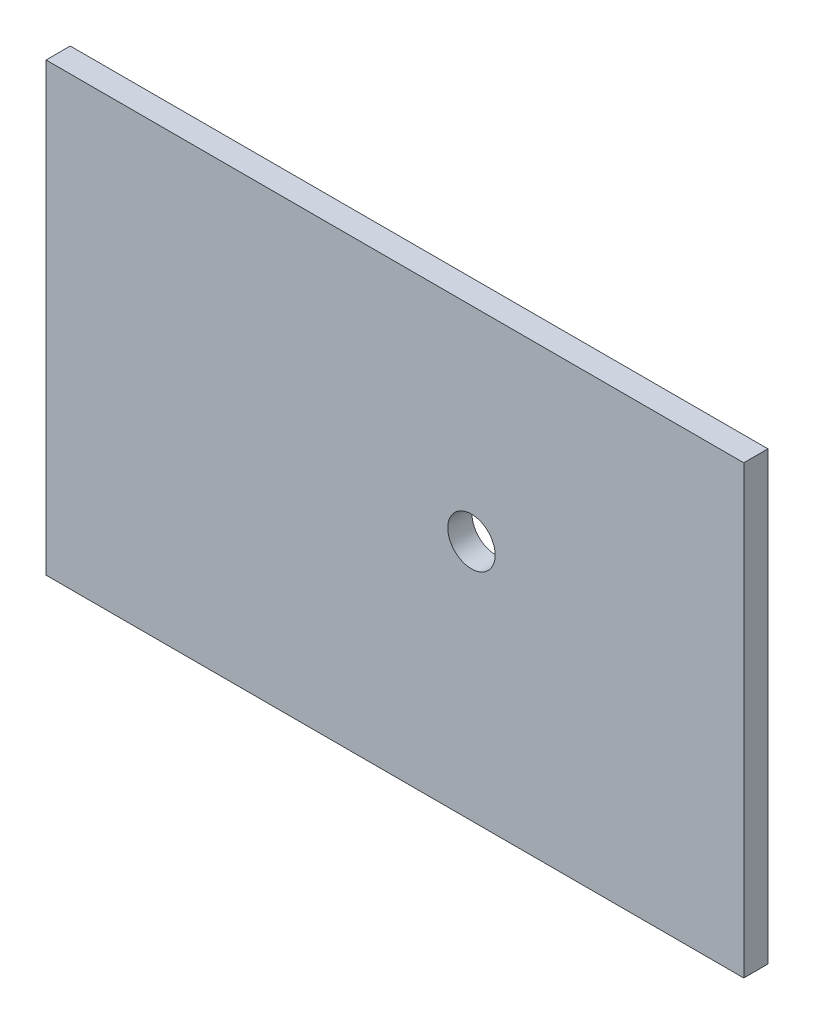
ISO-10303-21;
HEADER;
FILE_DESCRIPTION(('STEP AP214'),'2;1');
FILE_NAME('part.step','',(''),(''),'','','');
FILE_SCHEMA(('AUTOMOTIVE_DESIGN { 1 0 10303 214 1 1 1 1 }'));
ENDSEC;
DATA;
#1=APPLICATION_CONTEXT('core data for automotive mechanical design processes');
#2=APPLICATION_PROTOCOL_DEFINITION('international standard','automotive_design',2000,#1);
#3=PRODUCT_CONTEXT('',#1,'mechanical');
#4=PRODUCT('Part','Part','',(#3));
#5=PRODUCT_RELATED_PRODUCT_CATEGORY('part','',(#4));
#6=PRODUCT_DEFINITION_FORMATION('','',#4);
#7=PRODUCT_DEFINITION_CONTEXT('part definition',#1,'design');
#8=PRODUCT_DEFINITION('design','',#6,#7);
#9=PRODUCT_DEFINITION_SHAPE('','',#8);
#10=(LENGTH_UNIT() NAMED_UNIT(*) SI_UNIT(.MILLI.,.METRE.));
#11=(NAMED_UNIT(*) PLANE_ANGLE_UNIT() SI_UNIT($,.RADIAN.));
#12=(NAMED_UNIT(*) SI_UNIT($,.STERADIAN.) SOLID_ANGLE_UNIT());
#13=UNCERTAINTY_MEASURE_WITH_UNIT(LENGTH_MEASURE(1.E-05),#10,'distance_accuracy_value','');
#14=(GEOMETRIC_REPRESENTATION_CONTEXT(3) GLOBAL_UNCERTAINTY_ASSIGNED_CONTEXT((#13)) GLOBAL_UNIT_ASSIGNED_CONTEXT((#10,
#11,#12)) REPRESENTATION_CONTEXT('',''));
#15=CARTESIAN_POINT('',(0.,0.,0.));
#16=DIRECTION('',(0.,0.,1.));
#17=DIRECTION('',(1.,0.,0.));
#18=AXIS2_PLACEMENT_3D('',#15,#16,#17);
#19=CARTESIAN_POINT('',(282.588037109009,0.,2.54));
#20=DIRECTION('',(-1.,0.,0.));
#21=DIRECTION('',(0.,0.,1.));
#22=AXIS2_PLACEMENT_3D('',#19,#20,#21);
#23=PLANE('',#22);
#24=DIRECTION('',(0.,1.,0.));
#25=VECTOR('',#24,1.);
#26=CARTESIAN_POINT('',(282.588037109009,0.,0.));
#27=LINE('',#26,#25);
#28=CARTESIAN_POINT('',(282.588037109009,93.726,0.));
#29=VERTEX_POINT('',#28);
#30=CARTESIAN_POINT('',(282.588037109009,140.57260130174,0.));
#31=VERTEX_POINT('',#30);
#32=EDGE_CURVE('E107',#29,#31,#27,.T.);
#33=ORIENTED_EDGE('',*,*,#32,.T.);
#34=DIRECTION('',(0.,0.,-1.));
#35=VECTOR('',#34,1.);
#36=CARTESIAN_POINT('',(282.588037109009,140.57260130174,2.54));
#37=LINE('',#36,#35);
#38=CARTESIAN_POINT('',(282.588037109009,140.57260130174,2.54));
#39=VERTEX_POINT('',#38);
#40=EDGE_CURVE('E11',#39,#31,#37,.T.);
#41=ORIENTED_EDGE('',*,*,#40,.F.);
#42=DIRECTION('',(0.,1.,0.));
#43=VECTOR('',#42,1.);
#44=CARTESIAN_POINT('',(282.588037109009,0.,2.54));
#45=LINE('',#44,#43);
#46=CARTESIAN_POINT('',(282.588037109009,93.726,2.54));
#47=VERTEX_POINT('',#46);
#48=EDGE_CURVE('E80',#47,#39,#45,.T.);
#49=ORIENTED_EDGE('',*,*,#48,.F.);
#50=DIRECTION('',(0.,0.,-1.));
#51=VECTOR('',#50,1.);
#52=CARTESIAN_POINT('',(282.588037109009,93.726,2.54));
#53=LINE('',#52,#51);
#54=EDGE_CURVE('E106',#47,#29,#53,.T.);
#55=ORIENTED_EDGE('',*,*,#54,.T.);
#56=EDGE_LOOP('',(#33,#41,#49,#55));
#57=FACE_BOUND('',#56,.T.);
#58=ADVANCED_FACE('F41',(#57),#23,.F.);
#59=CARTESIAN_POINT('',(0.,140.57260130174,2.54));
#60=DIRECTION('',(0.,1.,0.));
#61=DIRECTION('',(0.,0.,1.));
#62=AXIS2_PLACEMENT_3D('',#59,#60,#61);
#63=PLANE('',#62);
#64=DIRECTION('',(1.,0.,0.));
#65=VECTOR('',#64,1.);
#66=CARTESIAN_POINT('',(0.,140.57260130174,0.));
#67=LINE('',#66,#65);
#68=CARTESIAN_POINT('',(209.333739125178,140.57260130174,0.));
#69=VERTEX_POINT('',#68);
#70=EDGE_CURVE('E89',#69,#31,#67,.T.);
#71=ORIENTED_EDGE('',*,*,#70,.F.);
#72=DIRECTION('',(0.,0.,-1.));
#73=VECTOR('',#72,1.);
#74=CARTESIAN_POINT('',(209.333739125178,140.57260130174,2.54));
#75=LINE('',#74,#73);
#76=CARTESIAN_POINT('',(209.333739125178,140.57260130174,2.54));
#77=VERTEX_POINT('',#76);
#78=EDGE_CURVE('E49',#77,#69,#75,.T.);
#79=ORIENTED_EDGE('',*,*,#78,.F.);
#80=DIRECTION('',(1.,0.,0.));
#81=VECTOR('',#80,1.);
#82=CARTESIAN_POINT('',(0.,140.57260130174,2.54));
#83=LINE('',#82,#81);
#84=EDGE_CURVE('E87',#77,#39,#83,.T.);
#85=ORIENTED_EDGE('',*,*,#84,.T.);
#86=ORIENTED_EDGE('',*,*,#40,.T.);
#87=EDGE_LOOP('',(#71,#79,#85,#86));
#88=FACE_BOUND('',#87,.T.);
#89=ADVANCED_FACE('F86',(#88),#63,.T.);
#90=CARTESIAN_POINT('',(209.333739125178,0.,2.54));
#91=DIRECTION('',(-1.,0.,0.));
#92=DIRECTION('',(0.,0.,1.));
#93=AXIS2_PLACEMENT_3D('',#90,#91,#92);
#94=PLANE('',#93);
#95=DIRECTION('',(0.,1.,0.));
#96=VECTOR('',#95,1.);
#97=CARTESIAN_POINT('',(209.333739125178,0.,0.));
#98=LINE('',#97,#96);
#99=CARTESIAN_POINT('',(209.333739125178,93.726,0.));
#100=VERTEX_POINT('',#99);
#101=EDGE_CURVE('E111',#100,#69,#98,.T.);
#102=ORIENTED_EDGE('',*,*,#101,.F.);
#103=DIRECTION('',(0.,0.,-1.));
#104=VECTOR('',#103,1.);
#105=CARTESIAN_POINT('',(209.333739125178,93.726,2.54));
#106=LINE('',#105,#104);
#107=CARTESIAN_POINT('',(209.333739125178,93.726,2.54));
#108=VERTEX_POINT('',#107);
#109=EDGE_CURVE('E72',#108,#100,#106,.T.);
#110=ORIENTED_EDGE('',*,*,#109,.F.);
#111=DIRECTION('',(0.,1.,0.));
#112=VECTOR('',#111,1.);
#113=CARTESIAN_POINT('',(209.333739125178,0.,2.54));
#114=LINE('',#113,#112);
#115=EDGE_CURVE('E96',#108,#77,#114,.T.);
#116=ORIENTED_EDGE('',*,*,#115,.T.);
#117=ORIENTED_EDGE('',*,*,#78,.T.);
#118=EDGE_LOOP('',(#102,#110,#116,#117));
#119=FACE_BOUND('',#118,.T.);
#120=ADVANCED_FACE('F98',(#119),#94,.T.);
#121=CARTESIAN_POINT('',(0.,93.726,2.54));
#122=DIRECTION('',(0.,1.,0.));
#123=DIRECTION('',(0.,0.,1.));
#124=AXIS2_PLACEMENT_3D('',#121,#122,#123);
#125=PLANE('',#124);
#126=DIRECTION('',(1.,0.,0.));
#127=VECTOR('',#126,1.);
#128=CARTESIAN_POINT('',(0.,93.726,0.));
#129=LINE('',#128,#127);
#130=EDGE_CURVE('E75',#100,#29,#129,.T.);
#131=ORIENTED_EDGE('',*,*,#130,.T.);
#132=ORIENTED_EDGE('',*,*,#54,.F.);
#133=DIRECTION('',(1.,0.,0.));
#134=VECTOR('',#133,1.);
#135=CARTESIAN_POINT('',(0.,93.726,2.54));
#136=LINE('',#135,#134);
#137=EDGE_CURVE('E57',#108,#47,#136,.T.);
#138=ORIENTED_EDGE('',*,*,#137,.F.);
#139=ORIENTED_EDGE('',*,*,#109,.T.);
#140=EDGE_LOOP('',(#131,#132,#138,#139));
#141=FACE_BOUND('',#140,.T.);
#142=ADVANCED_FACE('F129',(#141),#125,.F.);
#143=CARTESIAN_POINT('',(253.999999999993,119.126,2.54));
#144=DIRECTION('',(0.,0.,-1.));
#145=DIRECTION('',(-1.,0.,0.));
#146=AXIS2_PLACEMENT_3D('',#143,#144,#145);
#147=CYLINDRICAL_SURFACE('',#146,2.48920000000001);
#148=CARTESIAN_POINT('',(253.999999999993,119.126,2.54));
#149=DIRECTION('',(0.,0.,1.));
#150=DIRECTION('',(1.,0.,0.));
#151=AXIS2_PLACEMENT_3D('',#148,#149,#150);
#152=CIRCLE('',#151,2.48920000000001);
#153=CARTESIAN_POINT('',(256.489199999993,119.126,2.54));
#154=VERTEX_POINT('',#153);
#155=EDGE_CURVE('E100',#154,#154,#152,.T.);
#156=ORIENTED_EDGE('',*,*,#155,.T.);
#157=EDGE_LOOP('',(#156));
#158=FACE_BOUND('',#157,.T.);
#159=CARTESIAN_POINT('',(253.999999999993,119.126,0.));
#160=DIRECTION('',(0.,0.,1.));
#161=DIRECTION('',(1.,0.,0.));
#162=AXIS2_PLACEMENT_3D('',#159,#160,#161);
#163=CIRCLE('',#162,2.48920000000001);
#164=CARTESIAN_POINT('',(256.489199999993,119.126,0.));
#165=VERTEX_POINT('',#164);
#166=EDGE_CURVE('E114',#165,#165,#163,.T.);
#167=ORIENTED_EDGE('',*,*,#166,.F.);
#168=EDGE_LOOP('',(#167));
#169=FACE_BOUND('',#168,.T.);
#170=ADVANCED_FACE('F127',(#158,#169),#147,.F.);
#171=CARTESIAN_POINT('',(0.,0.,2.54));
#172=DIRECTION('',(0.,0.,1.));
#173=DIRECTION('',(1.,0.,0.));
#174=AXIS2_PLACEMENT_3D('',#171,#172,#173);
#175=PLANE('',#174);
#176=ORIENTED_EDGE('',*,*,#48,.T.);
#177=ORIENTED_EDGE('',*,*,#84,.F.);
#178=ORIENTED_EDGE('',*,*,#115,.F.);
#179=ORIENTED_EDGE('',*,*,#137,.T.);
#180=EDGE_LOOP('',(#176,#177,#178,#179));
#181=FACE_BOUND('',#180,.T.);
#182=ORIENTED_EDGE('',*,*,#155,.F.);
#183=EDGE_LOOP('',(#182));
#184=FACE_BOUND('',#183,.T.);
#185=ADVANCED_FACE('F94',(#181,#184),#175,.T.);
#186=CARTESIAN_POINT('',(0.,0.,0.));
#187=DIRECTION('',(0.,0.,1.));
#188=DIRECTION('',(1.,0.,0.));
#189=AXIS2_PLACEMENT_3D('',#186,#187,#188);
#190=PLANE('',#189);
#191=ORIENTED_EDGE('',*,*,#32,.F.);
#192=ORIENTED_EDGE('',*,*,#130,.F.);
#193=ORIENTED_EDGE('',*,*,#101,.T.);
#194=ORIENTED_EDGE('',*,*,#70,.T.);
#195=EDGE_LOOP('',(#191,#192,#193,#194));
#196=FACE_BOUND('',#195,.T.);
#197=ORIENTED_EDGE('',*,*,#166,.T.);
#198=EDGE_LOOP('',(#197));
#199=FACE_BOUND('',#198,.T.);
#200=ADVANCED_FACE('F121',(#196,#199),#190,.F.);
#201=CLOSED_SHELL('',(#58,#89,#120,#142,#170,#185,#200));
#202=MANIFOLD_SOLID_BREP('B2',#201);
#203=ADVANCED_BREP_SHAPE_REPRESENTATION('',(#18,#202),#14);
#204=SHAPE_DEFINITION_REPRESENTATION(#9,#203);
ENDSEC;
END-ISO-10303-21;
